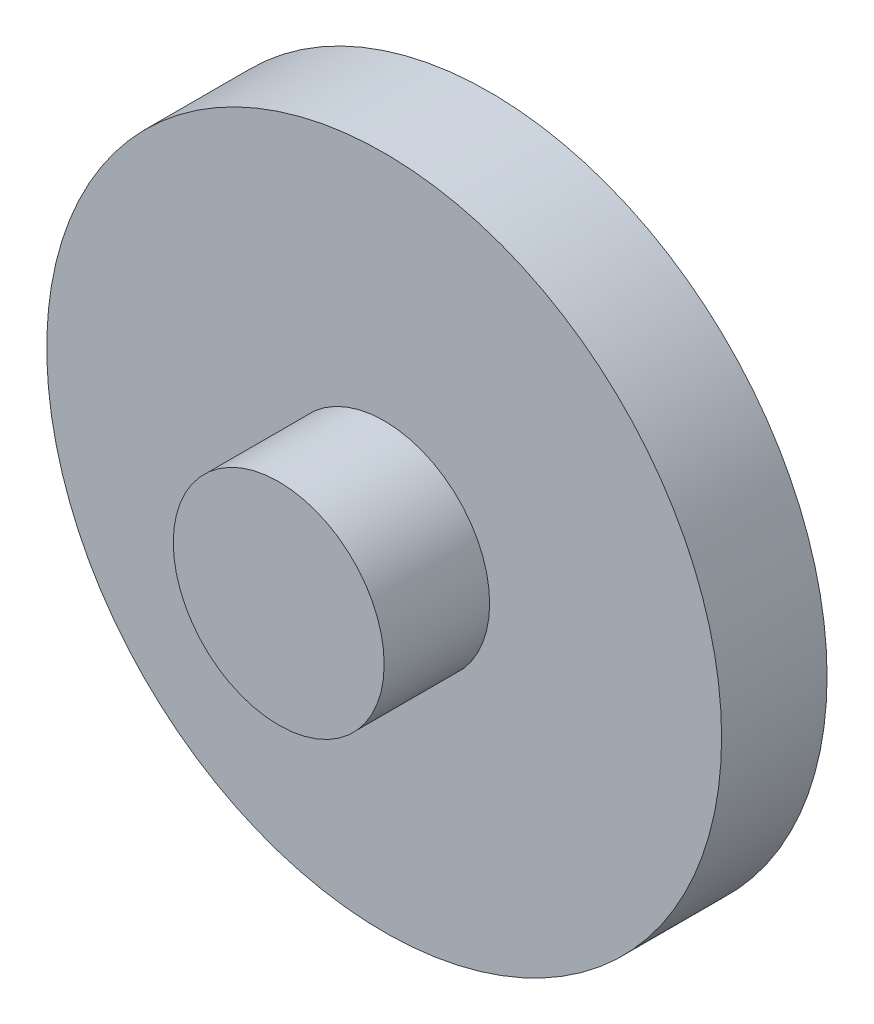
ISO-10303-21;
HEADER;
FILE_DESCRIPTION(('STEP AP214'),'2;1');
FILE_NAME('part.step','',(''),(''),'','','');
FILE_SCHEMA(('AUTOMOTIVE_DESIGN { 1 0 10303 214 1 1 1 1 }'));
ENDSEC;
DATA;
#1=APPLICATION_CONTEXT('core data for automotive mechanical design processes');
#2=APPLICATION_PROTOCOL_DEFINITION('international standard','automotive_design',2000,#1);
#3=PRODUCT_CONTEXT('',#1,'mechanical');
#4=PRODUCT('Part','Part','',(#3));
#5=PRODUCT_RELATED_PRODUCT_CATEGORY('part','',(#4));
#6=PRODUCT_DEFINITION_FORMATION('','',#4);
#7=PRODUCT_DEFINITION_CONTEXT('part definition',#1,'design');
#8=PRODUCT_DEFINITION('design','',#6,#7);
#9=PRODUCT_DEFINITION_SHAPE('','',#8);
#10=(LENGTH_UNIT() NAMED_UNIT(*) SI_UNIT(.MILLI.,.METRE.));
#11=(NAMED_UNIT(*) PLANE_ANGLE_UNIT() SI_UNIT($,.RADIAN.));
#12=(NAMED_UNIT(*) SI_UNIT($,.STERADIAN.) SOLID_ANGLE_UNIT());
#13=UNCERTAINTY_MEASURE_WITH_UNIT(LENGTH_MEASURE(1.E-05),#10,'distance_accuracy_value','');
#14=(GEOMETRIC_REPRESENTATION_CONTEXT(3) GLOBAL_UNCERTAINTY_ASSIGNED_CONTEXT((#13)) GLOBAL_UNIT_ASSIGNED_CONTEXT((#10,
#11,#12)) REPRESENTATION_CONTEXT('',''));
#15=CARTESIAN_POINT('',(0.,0.,0.));
#16=DIRECTION('',(0.,0.,1.));
#17=DIRECTION('',(1.,0.,0.));
#18=AXIS2_PLACEMENT_3D('',#15,#16,#17);
#19=CARTESIAN_POINT('',(0.,0.,10.));
#20=DIRECTION('',(0.,0.,-1.));
#21=DIRECTION('',(-1.,0.,0.));
#22=AXIS2_PLACEMENT_3D('',#19,#20,#21);
#23=CYLINDRICAL_SURFACE('',#22,32.);
#24=CARTESIAN_POINT('',(0.,0.,10.));
#25=DIRECTION('',(0.,0.,1.));
#26=DIRECTION('',(1.,0.,0.));
#27=AXIS2_PLACEMENT_3D('',#24,#25,#26);
#28=CIRCLE('',#27,32.);
#29=CARTESIAN_POINT('',(32.,0.,10.));
#30=VERTEX_POINT('',#29);
#31=EDGE_CURVE('E45',#30,#30,#28,.T.);
#32=ORIENTED_EDGE('',*,*,#31,.F.);
#33=EDGE_LOOP('',(#32));
#34=FACE_BOUND('',#33,.T.);
#35=CARTESIAN_POINT('',(0.,0.,0.));
#36=DIRECTION('',(0.,0.,1.));
#37=DIRECTION('',(1.,0.,0.));
#38=AXIS2_PLACEMENT_3D('',#35,#36,#37);
#39=CIRCLE('',#38,32.);
#40=CARTESIAN_POINT('',(32.,0.,0.));
#41=VERTEX_POINT('',#40);
#42=EDGE_CURVE('E40',#41,#41,#39,.T.);
#43=ORIENTED_EDGE('',*,*,#42,.T.);
#44=EDGE_LOOP('',(#43));
#45=FACE_BOUND('',#44,.T.);
#46=ADVANCED_FACE('F37',(#34,#45),#23,.T.);
#47=CARTESIAN_POINT('',(0.,0.,10.));
#48=DIRECTION('',(0.,0.,1.));
#49=DIRECTION('',(1.,0.,0.));
#50=AXIS2_PLACEMENT_3D('',#47,#48,#49);
#51=PLANE('',#50);
#52=CARTESIAN_POINT('',(0.,0.,10.));
#53=DIRECTION('',(0.,0.,1.));
#54=DIRECTION('',(1.,0.,0.));
#55=AXIS2_PLACEMENT_3D('',#52,#53,#54);
#56=CIRCLE('',#55,10.);
#57=CARTESIAN_POINT('',(10.,0.,10.));
#58=VERTEX_POINT('',#57);
#59=EDGE_CURVE('E10',#58,#58,#56,.T.);
#60=ORIENTED_EDGE('',*,*,#59,.F.);
#61=EDGE_LOOP('',(#60));
#62=FACE_BOUND('',#61,.T.);
#63=ORIENTED_EDGE('',*,*,#31,.T.);
#64=EDGE_LOOP('',(#63));
#65=FACE_BOUND('',#64,.T.);
#66=ADVANCED_FACE('F65',(#62,#65),#51,.T.);
#67=CARTESIAN_POINT('',(0.,0.,0.));
#68=DIRECTION('',(0.,0.,1.));
#69=DIRECTION('',(1.,0.,0.));
#70=AXIS2_PLACEMENT_3D('',#67,#68,#69);
#71=PLANE('',#70);
#72=ORIENTED_EDGE('',*,*,#42,.F.);
#73=EDGE_LOOP('',(#72));
#74=FACE_BOUND('',#73,.T.);
#75=ADVANCED_FACE('F62',(#74),#71,.F.);
#76=CARTESIAN_POINT('',(0.,0.,20.));
#77=DIRECTION('',(0.,0.,-1.));
#78=DIRECTION('',(-1.,0.,0.));
#79=AXIS2_PLACEMENT_3D('',#76,#77,#78);
#80=CYLINDRICAL_SURFACE('',#79,10.);
#81=CARTESIAN_POINT('',(0.,0.,20.));
#82=DIRECTION('',(0.,0.,1.));
#83=DIRECTION('',(1.,0.,0.));
#84=AXIS2_PLACEMENT_3D('',#81,#82,#83);
#85=CIRCLE('',#84,10.);
#86=CARTESIAN_POINT('',(10.,0.,20.));
#87=VERTEX_POINT('',#86);
#88=EDGE_CURVE('E52',#87,#87,#85,.T.);
#89=ORIENTED_EDGE('',*,*,#88,.F.);
#90=EDGE_LOOP('',(#89));
#91=FACE_BOUND('',#90,.T.);
#92=ORIENTED_EDGE('',*,*,#59,.T.);
#93=EDGE_LOOP('',(#92));
#94=FACE_BOUND('',#93,.T.);
#95=ADVANCED_FACE('F64',(#91,#94),#80,.T.);
#96=CARTESIAN_POINT('',(0.,0.,20.));
#97=DIRECTION('',(0.,0.,1.));
#98=DIRECTION('',(1.,0.,0.));
#99=AXIS2_PLACEMENT_3D('',#96,#97,#98);
#100=PLANE('',#99);
#101=ORIENTED_EDGE('',*,*,#88,.T.);
#102=EDGE_LOOP('',(#101));
#103=FACE_BOUND('',#102,.T.);
#104=ADVANCED_FACE('F70',(#103),#100,.T.);
#105=CLOSED_SHELL('',(#46,#66,#75,#95,#104));
#106=MANIFOLD_SOLID_BREP('B2',#105);
#107=ADVANCED_BREP_SHAPE_REPRESENTATION('',(#18,#106),#14);
#108=SHAPE_DEFINITION_REPRESENTATION(#9,#107);
ENDSEC;
END-ISO-10303-21;
